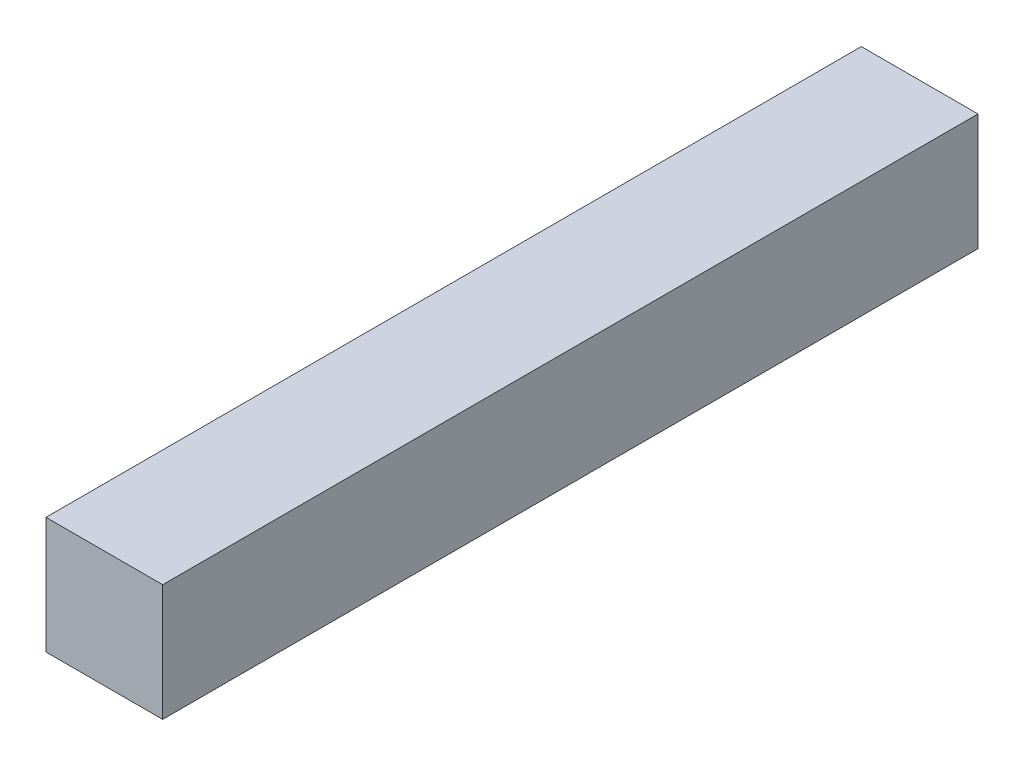
ISO-10303-21;
HEADER;
FILE_DESCRIPTION(('STEP AP214'),'2;1');
FILE_NAME('part.step','',(''),(''),'','','');
FILE_SCHEMA(('AUTOMOTIVE_DESIGN { 1 0 10303 214 1 1 1 1 }'));
ENDSEC;
DATA;
#1=APPLICATION_CONTEXT('core data for automotive mechanical design processes');
#2=APPLICATION_PROTOCOL_DEFINITION('international standard','automotive_design',2000,#1);
#3=PRODUCT_CONTEXT('',#1,'mechanical');
#4=PRODUCT('Part','Part','',(#3));
#5=PRODUCT_RELATED_PRODUCT_CATEGORY('part','',(#4));
#6=PRODUCT_DEFINITION_FORMATION('','',#4);
#7=PRODUCT_DEFINITION_CONTEXT('part definition',#1,'design');
#8=PRODUCT_DEFINITION('design','',#6,#7);
#9=PRODUCT_DEFINITION_SHAPE('','',#8);
#10=(LENGTH_UNIT() NAMED_UNIT(*) SI_UNIT(.MILLI.,.METRE.));
#11=(NAMED_UNIT(*) PLANE_ANGLE_UNIT() SI_UNIT($,.RADIAN.));
#12=(NAMED_UNIT(*) SI_UNIT($,.STERADIAN.) SOLID_ANGLE_UNIT());
#13=UNCERTAINTY_MEASURE_WITH_UNIT(LENGTH_MEASURE(1.E-05),#10,'distance_accuracy_value','');
#14=(GEOMETRIC_REPRESENTATION_CONTEXT(3) GLOBAL_UNCERTAINTY_ASSIGNED_CONTEXT((#13)) GLOBAL_UNIT_ASSIGNED_CONTEXT((#10,
#11,#12)) REPRESENTATION_CONTEXT('',''));
#15=CARTESIAN_POINT('',(0.,0.,0.));
#16=DIRECTION('',(0.,0.,1.));
#17=DIRECTION('',(1.,0.,0.));
#18=AXIS2_PLACEMENT_3D('',#15,#16,#17);
#19=CARTESIAN_POINT('',(0.13,0.,110.));
#20=DIRECTION('',(-1.,0.,0.));
#21=DIRECTION('',(0.,0.,1.));
#22=AXIS2_PLACEMENT_3D('',#19,#20,#21);
#23=PLANE('',#22);
#24=DIRECTION('',(0.,1.,0.));
#25=VECTOR('',#24,1.);
#26=CARTESIAN_POINT('',(0.13,0.,0.));
#27=LINE('',#26,#25);
#28=CARTESIAN_POINT('',(0.13,0.13,0.));
#29=VERTEX_POINT('',#28);
#30=CARTESIAN_POINT('',(0.13,15.87,0.));
#31=VERTEX_POINT('',#30);
#32=EDGE_CURVE('E96',#29,#31,#27,.T.);
#33=ORIENTED_EDGE('',*,*,#32,.F.);
#34=DIRECTION('',(0.,0.,-1.));
#35=VECTOR('',#34,1.);
#36=CARTESIAN_POINT('',(0.13,0.13,110.));
#37=LINE('',#36,#35);
#38=CARTESIAN_POINT('',(0.13,0.13,110.));
#39=VERTEX_POINT('',#38);
#40=EDGE_CURVE('E11',#39,#29,#37,.T.);
#41=ORIENTED_EDGE('',*,*,#40,.F.);
#42=DIRECTION('',(0.,1.,0.));
#43=VECTOR('',#42,1.);
#44=CARTESIAN_POINT('',(0.13,0.,110.));
#45=LINE('',#44,#43);
#46=CARTESIAN_POINT('',(0.13,15.87,110.));
#47=VERTEX_POINT('',#46);
#48=EDGE_CURVE('E81',#39,#47,#45,.T.);
#49=ORIENTED_EDGE('',*,*,#48,.T.);
#50=DIRECTION('',(0.,0.,-1.));
#51=VECTOR('',#50,1.);
#52=CARTESIAN_POINT('',(0.13,15.87,110.));
#53=LINE('',#52,#51);
#54=EDGE_CURVE('E49',#47,#31,#53,.T.);
#55=ORIENTED_EDGE('',*,*,#54,.T.);
#56=EDGE_LOOP('',(#33,#41,#49,#55));
#57=FACE_BOUND('',#56,.T.);
#58=ADVANCED_FACE('F33',(#57),#23,.T.);
#59=CARTESIAN_POINT('',(0.,0.13,110.));
#60=DIRECTION('',(0.,1.,0.));
#61=DIRECTION('',(0.,0.,1.));
#62=AXIS2_PLACEMENT_3D('',#59,#60,#61);
#63=PLANE('',#62);
#64=DIRECTION('',(1.,0.,0.));
#65=VECTOR('',#64,1.);
#66=CARTESIAN_POINT('',(0.,0.13,0.));
#67=LINE('',#66,#65);
#68=CARTESIAN_POINT('',(15.87,0.13,0.));
#69=VERTEX_POINT('',#68);
#70=EDGE_CURVE('E87',#29,#69,#67,.T.);
#71=ORIENTED_EDGE('',*,*,#70,.T.);
#72=DIRECTION('',(0.,0.,-1.));
#73=VECTOR('',#72,1.);
#74=CARTESIAN_POINT('',(15.87,0.13,110.));
#75=LINE('',#74,#73);
#76=CARTESIAN_POINT('',(15.87,0.13,110.));
#77=VERTEX_POINT('',#76);
#78=EDGE_CURVE('E41',#77,#69,#75,.T.);
#79=ORIENTED_EDGE('',*,*,#78,.F.);
#80=DIRECTION('',(1.,0.,0.));
#81=VECTOR('',#80,1.);
#82=CARTESIAN_POINT('',(0.,0.13,110.));
#83=LINE('',#82,#81);
#84=EDGE_CURVE('E75',#39,#77,#83,.T.);
#85=ORIENTED_EDGE('',*,*,#84,.F.);
#86=ORIENTED_EDGE('',*,*,#40,.T.);
#87=EDGE_LOOP('',(#71,#79,#85,#86));
#88=FACE_BOUND('',#87,.T.);
#89=ADVANCED_FACE('F85',(#88),#63,.F.);
#90=CARTESIAN_POINT('',(15.87,0.,110.));
#91=DIRECTION('',(-1.,0.,0.));
#92=DIRECTION('',(0.,0.,1.));
#93=AXIS2_PLACEMENT_3D('',#90,#91,#92);
#94=PLANE('',#93);
#95=DIRECTION('',(0.,1.,0.));
#96=VECTOR('',#95,1.);
#97=CARTESIAN_POINT('',(15.87,0.,0.));
#98=LINE('',#97,#96);
#99=CARTESIAN_POINT('',(15.87,15.87,0.));
#100=VERTEX_POINT('',#99);
#101=EDGE_CURVE('E99',#69,#100,#98,.T.);
#102=ORIENTED_EDGE('',*,*,#101,.T.);
#103=DIRECTION('',(0.,0.,-1.));
#104=VECTOR('',#103,1.);
#105=CARTESIAN_POINT('',(15.87,15.87,110.));
#106=LINE('',#105,#104);
#107=CARTESIAN_POINT('',(15.87,15.87,110.));
#108=VERTEX_POINT('',#107);
#109=EDGE_CURVE('E63',#108,#100,#106,.T.);
#110=ORIENTED_EDGE('',*,*,#109,.F.);
#111=DIRECTION('',(0.,1.,0.));
#112=VECTOR('',#111,1.);
#113=CARTESIAN_POINT('',(15.87,0.,110.));
#114=LINE('',#113,#112);
#115=EDGE_CURVE('E80',#77,#108,#114,.T.);
#116=ORIENTED_EDGE('',*,*,#115,.F.);
#117=ORIENTED_EDGE('',*,*,#78,.T.);
#118=EDGE_LOOP('',(#102,#110,#116,#117));
#119=FACE_BOUND('',#118,.T.);
#120=ADVANCED_FACE('F90',(#119),#94,.F.);
#121=CARTESIAN_POINT('',(0.,15.87,110.));
#122=DIRECTION('',(0.,1.,0.));
#123=DIRECTION('',(0.,0.,1.));
#124=AXIS2_PLACEMENT_3D('',#121,#122,#123);
#125=PLANE('',#124);
#126=DIRECTION('',(1.,0.,0.));
#127=VECTOR('',#126,1.);
#128=CARTESIAN_POINT('',(0.,15.87,0.));
#129=LINE('',#128,#127);
#130=EDGE_CURVE('E101',#31,#100,#129,.T.);
#131=ORIENTED_EDGE('',*,*,#130,.F.);
#132=ORIENTED_EDGE('',*,*,#54,.F.);
#133=DIRECTION('',(1.,0.,0.));
#134=VECTOR('',#133,1.);
#135=CARTESIAN_POINT('',(0.,15.87,110.));
#136=LINE('',#135,#134);
#137=EDGE_CURVE('E91',#47,#108,#136,.T.);
#138=ORIENTED_EDGE('',*,*,#137,.T.);
#139=ORIENTED_EDGE('',*,*,#109,.T.);
#140=EDGE_LOOP('',(#131,#132,#138,#139));
#141=FACE_BOUND('',#140,.T.);
#142=ADVANCED_FACE('F106',(#141),#125,.T.);
#143=CARTESIAN_POINT('',(0.,0.,110.));
#144=DIRECTION('',(0.,0.,1.));
#145=DIRECTION('',(1.,0.,0.));
#146=AXIS2_PLACEMENT_3D('',#143,#144,#145);
#147=PLANE('',#146);
#148=ORIENTED_EDGE('',*,*,#48,.F.);
#149=ORIENTED_EDGE('',*,*,#84,.T.);
#150=ORIENTED_EDGE('',*,*,#115,.T.);
#151=ORIENTED_EDGE('',*,*,#137,.F.);
#152=EDGE_LOOP('',(#148,#149,#150,#151));
#153=FACE_BOUND('',#152,.T.);
#154=ADVANCED_FACE('F77',(#153),#147,.T.);
#155=CARTESIAN_POINT('',(0.,0.,0.));
#156=DIRECTION('',(0.,0.,1.));
#157=DIRECTION('',(1.,0.,0.));
#158=AXIS2_PLACEMENT_3D('',#155,#156,#157);
#159=PLANE('',#158);
#160=ORIENTED_EDGE('',*,*,#32,.T.);
#161=ORIENTED_EDGE('',*,*,#130,.T.);
#162=ORIENTED_EDGE('',*,*,#101,.F.);
#163=ORIENTED_EDGE('',*,*,#70,.F.);
#164=EDGE_LOOP('',(#160,#161,#162,#163));
#165=FACE_BOUND('',#164,.T.);
#166=ADVANCED_FACE('F113',(#165),#159,.F.);
#167=CLOSED_SHELL('',(#58,#89,#120,#142,#154,#166));
#168=MANIFOLD_SOLID_BREP('B2',#167);
#169=ADVANCED_BREP_SHAPE_REPRESENTATION('',(#18,#168),#14);
#170=SHAPE_DEFINITION_REPRESENTATION(#9,#169);
ENDSEC;
END-ISO-10303-21;
